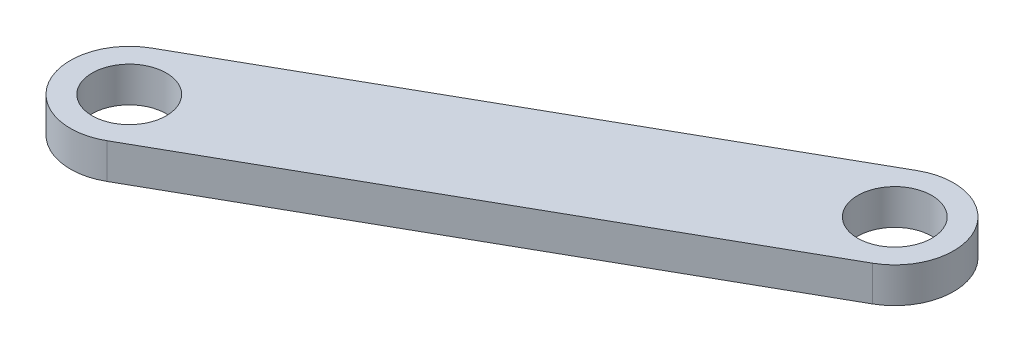
ISO-10303-21;
HEADER;
FILE_DESCRIPTION(('STEP AP214'),'2;1');
FILE_NAME('part.step','',(''),(''),'','','');
FILE_SCHEMA(('AUTOMOTIVE_DESIGN { 1 0 10303 214 1 1 1 1 }'));
ENDSEC;
DATA;
#1=APPLICATION_CONTEXT('core data for automotive mechanical design processes');
#2=APPLICATION_PROTOCOL_DEFINITION('international standard','automotive_design',2000,#1);
#3=PRODUCT_CONTEXT('',#1,'mechanical');
#4=PRODUCT('Part','Part','',(#3));
#5=PRODUCT_RELATED_PRODUCT_CATEGORY('part','',(#4));
#6=PRODUCT_DEFINITION_FORMATION('','',#4);
#7=PRODUCT_DEFINITION_CONTEXT('part definition',#1,'design');
#8=PRODUCT_DEFINITION('design','',#6,#7);
#9=PRODUCT_DEFINITION_SHAPE('','',#8);
#10=(LENGTH_UNIT() NAMED_UNIT(*) SI_UNIT(.MILLI.,.METRE.));
#11=(NAMED_UNIT(*) PLANE_ANGLE_UNIT() SI_UNIT($,.RADIAN.));
#12=(NAMED_UNIT(*) SI_UNIT($,.STERADIAN.) SOLID_ANGLE_UNIT());
#13=UNCERTAINTY_MEASURE_WITH_UNIT(LENGTH_MEASURE(1.E-05),#10,'distance_accuracy_value','');
#14=(GEOMETRIC_REPRESENTATION_CONTEXT(3) GLOBAL_UNCERTAINTY_ASSIGNED_CONTEXT((#13)) GLOBAL_UNIT_ASSIGNED_CONTEXT((#10,
#11,#12)) REPRESENTATION_CONTEXT('',''));
#15=CARTESIAN_POINT('',(0.,0.,0.));
#16=DIRECTION('',(0.,0.,1.));
#17=DIRECTION('',(1.,0.,0.));
#18=AXIS2_PLACEMENT_3D('',#15,#16,#17);
#19=CARTESIAN_POINT('',(0.,-1.905,0.));
#20=DIRECTION('',(0.,1.,0.));
#21=DIRECTION('',(0.,0.,1.));
#22=AXIS2_PLACEMENT_3D('',#19,#20,#21);
#23=CYLINDRICAL_SURFACE('',#22,3.175);
#24=CARTESIAN_POINT('',(0.,0.,0.));
#25=DIRECTION('',(0.,1.,0.));
#26=DIRECTION('',(0.,0.,-1.));
#27=AXIS2_PLACEMENT_3D('',#24,#25,#26);
#28=CIRCLE('',#27,3.175);
#29=CARTESIAN_POINT('',(1.56402198628514,0.,2.76305270062239));
#30=VERTEX_POINT('',#29);
#31=CARTESIAN_POINT('',(-1.56402198628514,0.,-2.76305270062239));
#32=VERTEX_POINT('',#31);
#33=EDGE_CURVE('E110',#30,#32,#28,.T.);
#34=ORIENTED_EDGE('',*,*,#33,.F.);
#35=DIRECTION('',(0.,1.,0.));
#36=VECTOR('',#35,1.);
#37=CARTESIAN_POINT('',(1.56402198628514,-1.905,2.76305270062239));
#38=LINE('',#37,#36);
#39=CARTESIAN_POINT('',(1.56402198628514,-1.905,2.76305270062239));
#40=VERTEX_POINT('',#39);
#41=EDGE_CURVE('E11',#40,#30,#38,.T.);
#42=ORIENTED_EDGE('',*,*,#41,.F.);
#43=CARTESIAN_POINT('',(0.,-1.905,0.));
#44=DIRECTION('',(0.,1.,0.));
#45=DIRECTION('',(0.,0.,-1.));
#46=AXIS2_PLACEMENT_3D('',#43,#44,#45);
#47=CIRCLE('',#46,3.175);
#48=CARTESIAN_POINT('',(-1.56402198628514,-1.905,-2.76305270062239));
#49=VERTEX_POINT('',#48);
#50=EDGE_CURVE('E101',#40,#49,#47,.T.);
#51=ORIENTED_EDGE('',*,*,#50,.T.);
#52=DIRECTION('',(0.,1.,0.));
#53=VECTOR('',#52,1.);
#54=CARTESIAN_POINT('',(-1.56402198628514,-1.905,-2.76305270062239));
#55=LINE('',#54,#53);
#56=EDGE_CURVE('E42',#49,#32,#55,.T.);
#57=ORIENTED_EDGE('',*,*,#56,.T.);
#58=EDGE_LOOP('',(#34,#42,#51,#57));
#59=FACE_BOUND('',#58,.T.);
#60=ADVANCED_FACE('F39',(#59),#23,.T.);
#61=CARTESIAN_POINT('',(1.56402198628514,-1.905,2.76305270062239));
#62=DIRECTION('',(0.492605350011069,0.,0.870252819093666));
#63=DIRECTION('',(0.870252819093666,0.,-0.492605350011069));
#64=AXIS2_PLACEMENT_3D('',#61,#62,#63);
#65=PLANE('',#64);
#66=DIRECTION('',(0.870252819093666,0.,-0.492605350011069));
#67=VECTOR('',#66,1.);
#68=CARTESIAN_POINT('',(1.56402198628514,0.,2.76305270062239));
#69=LINE('',#68,#67);
#70=CARTESIAN_POINT('',(-24.7985574957149,0.,17.6855527006224));
#71=VERTEX_POINT('',#70);
#72=EDGE_CURVE('E104',#71,#30,#69,.T.);
#73=ORIENTED_EDGE('',*,*,#72,.F.);
#74=DIRECTION('',(0.,1.,0.));
#75=VECTOR('',#74,1.);
#76=CARTESIAN_POINT('',(-24.7985574957149,-1.905,17.6855527006224));
#77=LINE('',#76,#75);
#78=CARTESIAN_POINT('',(-24.7985574957149,-1.905,17.6855527006224));
#79=VERTEX_POINT('',#78);
#80=EDGE_CURVE('E49',#79,#71,#77,.T.);
#81=ORIENTED_EDGE('',*,*,#80,.F.);
#82=DIRECTION('',(0.870252819093666,0.,-0.492605350011069));
#83=VECTOR('',#82,1.);
#84=CARTESIAN_POINT('',(1.56402198628514,-1.905,2.76305270062239));
#85=LINE('',#84,#83);
#86=EDGE_CURVE('E96',#79,#40,#85,.T.);
#87=ORIENTED_EDGE('',*,*,#86,.T.);
#88=ORIENTED_EDGE('',*,*,#41,.T.);
#89=EDGE_LOOP('',(#73,#81,#87,#88));
#90=FACE_BOUND('',#89,.T.);
#91=ADVANCED_FACE('F127',(#90),#65,.T.);
#92=CARTESIAN_POINT('',(-26.362579482,-1.905,14.9225));
#93=DIRECTION('',(0.,1.,0.));
#94=DIRECTION('',(0.,0.,1.));
#95=AXIS2_PLACEMENT_3D('',#92,#93,#94);
#96=CYLINDRICAL_SURFACE('',#95,3.175);
#97=CARTESIAN_POINT('',(-26.362579482,0.,14.9225));
#98=DIRECTION('',(0.,1.,0.));
#99=DIRECTION('',(0.,0.,-1.));
#100=AXIS2_PLACEMENT_3D('',#97,#98,#99);
#101=CIRCLE('',#100,3.175);
#102=CARTESIAN_POINT('',(-27.9266014682851,0.,12.1594472993776));
#103=VERTEX_POINT('',#102);
#104=EDGE_CURVE('E90',#103,#71,#101,.T.);
#105=ORIENTED_EDGE('',*,*,#104,.F.);
#106=DIRECTION('',(0.,1.,0.));
#107=VECTOR('',#106,1.);
#108=CARTESIAN_POINT('',(-27.9266014682851,-1.905,12.1594472993776));
#109=LINE('',#108,#107);
#110=CARTESIAN_POINT('',(-27.9266014682851,-1.905,12.1594472993776));
#111=VERTEX_POINT('',#110);
#112=EDGE_CURVE('E85',#111,#103,#109,.T.);
#113=ORIENTED_EDGE('',*,*,#112,.F.);
#114=CARTESIAN_POINT('',(-26.362579482,-1.905,14.9225));
#115=DIRECTION('',(0.,1.,0.));
#116=DIRECTION('',(0.,0.,-1.));
#117=AXIS2_PLACEMENT_3D('',#114,#115,#116);
#118=CIRCLE('',#117,3.175);
#119=EDGE_CURVE('E88',#111,#79,#118,.T.);
#120=ORIENTED_EDGE('',*,*,#119,.T.);
#121=ORIENTED_EDGE('',*,*,#80,.T.);
#122=EDGE_LOOP('',(#105,#113,#120,#121));
#123=FACE_BOUND('',#122,.T.);
#124=ADVANCED_FACE('F87',(#123),#96,.T.);
#125=CARTESIAN_POINT('',(-1.56402198628514,-1.905,-2.76305270062239));
#126=DIRECTION('',(-0.492605350011069,0.,-0.870252819093666));
#127=DIRECTION('',(-0.870252819093666,0.,0.492605350011069));
#128=AXIS2_PLACEMENT_3D('',#125,#126,#127);
#129=PLANE('',#128);
#130=DIRECTION('',(-0.870252819093666,0.,0.492605350011069));
#131=VECTOR('',#130,1.);
#132=CARTESIAN_POINT('',(-1.56402198628514,0.,-2.76305270062239));
#133=LINE('',#132,#131);
#134=EDGE_CURVE('E114',#32,#103,#133,.T.);
#135=ORIENTED_EDGE('',*,*,#134,.F.);
#136=ORIENTED_EDGE('',*,*,#56,.F.);
#137=DIRECTION('',(-0.870252819093666,0.,0.492605350011069));
#138=VECTOR('',#137,1.);
#139=CARTESIAN_POINT('',(-1.56402198628514,-1.905,-2.76305270062239));
#140=LINE('',#139,#138);
#141=EDGE_CURVE('E95',#49,#111,#140,.T.);
#142=ORIENTED_EDGE('',*,*,#141,.T.);
#143=ORIENTED_EDGE('',*,*,#112,.T.);
#144=EDGE_LOOP('',(#135,#136,#142,#143));
#145=FACE_BOUND('',#144,.T.);
#146=ADVANCED_FACE('F99',(#145),#129,.T.);
#147=CARTESIAN_POINT('',(0.,-1.905,0.));
#148=DIRECTION('',(0.,-1.,0.));
#149=DIRECTION('',(0.,0.,-1.));
#150=AXIS2_PLACEMENT_3D('',#147,#148,#149);
#151=PLANE('',#150);
#152=CARTESIAN_POINT('',(-26.362579482,-1.905,14.9225));
#153=DIRECTION('',(0.,1.,0.));
#154=DIRECTION('',(0.,0.,1.));
#155=AXIS2_PLACEMENT_3D('',#152,#153,#154);
#156=CIRCLE('',#155,2.);
#157=CARTESIAN_POINT('',(-26.362579482,-1.905,16.9225));
#158=VERTEX_POINT('',#157);
#159=EDGE_CURVE('E160',#158,#158,#156,.T.);
#160=ORIENTED_EDGE('',*,*,#159,.T.);
#161=EDGE_LOOP('',(#160));
#162=FACE_BOUND('',#161,.T.);
#163=CARTESIAN_POINT('',(0.,-1.905,0.));
#164=DIRECTION('',(0.,1.,0.));
#165=DIRECTION('',(0.,0.,1.));
#166=AXIS2_PLACEMENT_3D('',#163,#164,#165);
#167=CIRCLE('',#166,2.);
#168=CARTESIAN_POINT('',(0.,-1.905,2.));
#169=VERTEX_POINT('',#168);
#170=EDGE_CURVE('E115',#169,#169,#167,.T.);
#171=ORIENTED_EDGE('',*,*,#170,.T.);
#172=EDGE_LOOP('',(#171));
#173=FACE_BOUND('',#172,.T.);
#174=ORIENTED_EDGE('',*,*,#50,.F.);
#175=ORIENTED_EDGE('',*,*,#86,.F.);
#176=ORIENTED_EDGE('',*,*,#119,.F.);
#177=ORIENTED_EDGE('',*,*,#141,.F.);
#178=EDGE_LOOP('',(#174,#175,#176,#177));
#179=FACE_BOUND('',#178,.T.);
#180=ADVANCED_FACE('F94',(#162,#173,#179),#151,.T.);
#181=CARTESIAN_POINT('',(0.,0.,0.));
#182=DIRECTION('',(0.,-1.,0.));
#183=DIRECTION('',(0.,0.,-1.));
#184=AXIS2_PLACEMENT_3D('',#181,#182,#183);
#185=PLANE('',#184);
#186=CARTESIAN_POINT('',(-26.362579482,0.,14.9225));
#187=DIRECTION('',(0.,1.,0.));
#188=DIRECTION('',(0.,0.,1.));
#189=AXIS2_PLACEMENT_3D('',#186,#187,#188);
#190=CIRCLE('',#189,2.);
#191=CARTESIAN_POINT('',(-26.362579482,0.,16.9225));
#192=VERTEX_POINT('',#191);
#193=EDGE_CURVE('E163',#192,#192,#190,.T.);
#194=ORIENTED_EDGE('',*,*,#193,.F.);
#195=EDGE_LOOP('',(#194));
#196=FACE_BOUND('',#195,.T.);
#197=CARTESIAN_POINT('',(0.,0.,0.));
#198=DIRECTION('',(0.,1.,0.));
#199=DIRECTION('',(0.,0.,1.));
#200=AXIS2_PLACEMENT_3D('',#197,#198,#199);
#201=CIRCLE('',#200,2.);
#202=CARTESIAN_POINT('',(0.,0.,2.));
#203=VERTEX_POINT('',#202);
#204=EDGE_CURVE('E167',#203,#203,#201,.T.);
#205=ORIENTED_EDGE('',*,*,#204,.F.);
#206=EDGE_LOOP('',(#205));
#207=FACE_BOUND('',#206,.T.);
#208=ORIENTED_EDGE('',*,*,#33,.T.);
#209=ORIENTED_EDGE('',*,*,#134,.T.);
#210=ORIENTED_EDGE('',*,*,#104,.T.);
#211=ORIENTED_EDGE('',*,*,#72,.T.);
#212=EDGE_LOOP('',(#208,#209,#210,#211));
#213=FACE_BOUND('',#212,.T.);
#214=ADVANCED_FACE('F126',(#196,#207,#213),#185,.F.);
#215=CARTESIAN_POINT('',(0.,-1.905,0.));
#216=DIRECTION('',(0.,1.,0.));
#217=DIRECTION('',(0.,0.,1.));
#218=AXIS2_PLACEMENT_3D('',#215,#216,#217);
#219=CYLINDRICAL_SURFACE('',#218,2.);
#220=CARTESIAN_POINT('',(0.,-1.905,2.));
#221=CARTESIAN_POINT('',(0.,-1.88515625,2.));
#222=CARTESIAN_POINT('',(0.,-1.8653125,2.));
#223=CARTESIAN_POINT('',(0.,-1.825625,2.));
#224=CARTESIAN_POINT('',(0.,-1.80578125,2.));
#225=CARTESIAN_POINT('',(0.,-1.76609375,2.));
#226=CARTESIAN_POINT('',(0.,-1.74625,2.));
#227=CARTESIAN_POINT('',(0.,-1.7065625,2.));
#228=CARTESIAN_POINT('',(0.,-1.68671875,2.));
#229=CARTESIAN_POINT('',(0.,-1.64703125,2.));
#230=CARTESIAN_POINT('',(0.,-1.6271875,2.));
#231=CARTESIAN_POINT('',(0.,-1.5875,2.));
#232=CARTESIAN_POINT('',(0.,-1.56765625,2.));
#233=CARTESIAN_POINT('',(0.,-1.52796875,2.));
#234=CARTESIAN_POINT('',(0.,-1.508125,2.));
#235=CARTESIAN_POINT('',(0.,-1.4684375,2.));
#236=CARTESIAN_POINT('',(0.,-1.44859375,2.));
#237=CARTESIAN_POINT('',(0.,-1.40890625,2.));
#238=CARTESIAN_POINT('',(0.,-1.3890625,2.));
#239=CARTESIAN_POINT('',(0.,-1.349375,2.));
#240=CARTESIAN_POINT('',(0.,-1.32953125,2.));
#241=CARTESIAN_POINT('',(0.,-1.28984375,2.));
#242=CARTESIAN_POINT('',(0.,-1.27,2.));
#243=CARTESIAN_POINT('',(0.,-1.2303125,2.));
#244=CARTESIAN_POINT('',(0.,-1.21046875,2.));
#245=CARTESIAN_POINT('',(0.,-1.17078125,2.));
#246=CARTESIAN_POINT('',(0.,-1.1509375,2.));
#247=CARTESIAN_POINT('',(0.,-1.11125,2.));
#248=CARTESIAN_POINT('',(0.,-1.09140625,2.));
#249=CARTESIAN_POINT('',(0.,-1.05171875,2.));
#250=CARTESIAN_POINT('',(0.,-1.031875,2.));
#251=CARTESIAN_POINT('',(0.,-0.9921875,2.));
#252=CARTESIAN_POINT('',(0.,-0.97234375,2.));
#253=CARTESIAN_POINT('',(0.,-0.93265625,2.));
#254=CARTESIAN_POINT('',(0.,-0.9128125,2.));
#255=CARTESIAN_POINT('',(0.,-0.873125,2.));
#256=CARTESIAN_POINT('',(0.,-0.85328125,2.));
#257=CARTESIAN_POINT('',(0.,-0.81359375,2.));
#258=CARTESIAN_POINT('',(0.,-0.79375,2.));
#259=CARTESIAN_POINT('',(0.,-0.7540625,2.));
#260=CARTESIAN_POINT('',(0.,-0.73421875,2.));
#261=CARTESIAN_POINT('',(0.,-0.69453125,2.));
#262=CARTESIAN_POINT('',(0.,-0.6746875,2.));
#263=CARTESIAN_POINT('',(0.,-0.635,2.));
#264=CARTESIAN_POINT('',(0.,-0.61515625,2.));
#265=CARTESIAN_POINT('',(0.,-0.57546875,2.));
#266=CARTESIAN_POINT('',(0.,-0.555625,2.));
#267=CARTESIAN_POINT('',(0.,-0.5159375,2.));
#268=CARTESIAN_POINT('',(0.,-0.49609375,2.));
#269=CARTESIAN_POINT('',(0.,-0.45640625,2.));
#270=CARTESIAN_POINT('',(0.,-0.4365625,2.));
#271=CARTESIAN_POINT('',(0.,-0.396875,2.));
#272=CARTESIAN_POINT('',(0.,-0.37703125,2.));
#273=CARTESIAN_POINT('',(0.,-0.33734375,2.));
#274=CARTESIAN_POINT('',(0.,-0.3175,2.));
#275=CARTESIAN_POINT('',(0.,-0.2778125,2.));
#276=CARTESIAN_POINT('',(0.,-0.25796875,2.));
#277=CARTESIAN_POINT('',(0.,-0.21828125,2.));
#278=CARTESIAN_POINT('',(0.,-0.1984375,2.));
#279=CARTESIAN_POINT('',(0.,-0.15875,2.));
#280=CARTESIAN_POINT('',(0.,-0.13890625,2.));
#281=CARTESIAN_POINT('',(0.,-0.09921875,2.));
#282=CARTESIAN_POINT('',(0.,-0.0793749999999999,2.));
#283=CARTESIAN_POINT('',(0.,-0.0396874999999999,2.));
#284=CARTESIAN_POINT('',(0.,-0.01984375,2.));
#285=CARTESIAN_POINT('',(0.,0.,2.));
#286=B_SPLINE_CURVE_WITH_KNOTS('',3,(#220,#221,#222,#223,#224,#225,#226,#227,#228,#229,#230,
#231,#232,#233,#234,#235,#236,#237,#238,#239,#240,#241,#242,#243,#244,#245,#246,#247,#248,#249,
#250,#251,#252,#253,#254,#255,#256,#257,#258,#259,#260,#261,#262,#263,#264,#265,#266,#267,#268,
#269,#270,#271,#272,#273,#274,#275,#276,#277,#278,#279,#280,#281,#282,#283,#284,#285),
.UNSPECIFIED.,.F.,.F.,(4,2,2,2,2,2,2,2,2,2,2,2,2,2,2,2,2,2,2,2,2,2,2,2,2,2,2,2,2,2,2,2,4),(0.,
0.0595312500000001,0.1190625,0.17859375,0.238125,0.29765625,0.3571875,0.41671875,0.47625,
0.53578125,0.5953125,0.65484375,0.714375,0.77390625,0.8334375,0.89296875,0.9525,1.01203125,
1.0715625,1.13109375,1.190625,1.25015625,1.3096875,1.36921875,1.42875,1.48828125,1.5478125,
1.60734375,1.666875,1.72640625,1.7859375,1.84546875,1.905),.UNSPECIFIED.);
#287=EDGE_CURVE('BSEAM145',#169,#203,#286,.T.);
#288=ORIENTED_EDGE('',*,*,#170,.F.);
#289=ORIENTED_EDGE('',*,*,#204,.T.);
#290=ORIENTED_EDGE('',*,*,#287,.T.);
#291=ORIENTED_EDGE('',*,*,#287,.F.);
#292=EDGE_LOOP('',(#288,#290,#289,#291));
#293=FACE_BOUND('',#292,.T.);
#294=ADVANCED_FACE('F145',(#293),#219,.F.);
#295=CARTESIAN_POINT('',(-26.362579482,-1.905,14.9225));
#296=DIRECTION('',(0.,1.,0.));
#297=DIRECTION('',(0.,0.,1.));
#298=AXIS2_PLACEMENT_3D('',#295,#296,#297);
#299=CYLINDRICAL_SURFACE('',#298,2.);
#300=CARTESIAN_POINT('',(-26.362579482,-1.905,16.9225));
#301=CARTESIAN_POINT('',(-26.362579482,-1.88515625,16.9225));
#302=CARTESIAN_POINT('',(-26.362579482,-1.8653125,16.9225));
#303=CARTESIAN_POINT('',(-26.362579482,-1.825625,16.9225));
#304=CARTESIAN_POINT('',(-26.362579482,-1.80578125,16.9225));
#305=CARTESIAN_POINT('',(-26.362579482,-1.76609375,16.9225));
#306=CARTESIAN_POINT('',(-26.362579482,-1.74625,16.9225));
#307=CARTESIAN_POINT('',(-26.362579482,-1.7065625,16.9225));
#308=CARTESIAN_POINT('',(-26.362579482,-1.68671875,16.9225));
#309=CARTESIAN_POINT('',(-26.362579482,-1.64703125,16.9225));
#310=CARTESIAN_POINT('',(-26.362579482,-1.6271875,16.9225));
#311=CARTESIAN_POINT('',(-26.362579482,-1.5875,16.9225));
#312=CARTESIAN_POINT('',(-26.362579482,-1.56765625,16.9225));
#313=CARTESIAN_POINT('',(-26.362579482,-1.52796875,16.9225));
#314=CARTESIAN_POINT('',(-26.362579482,-1.508125,16.9225));
#315=CARTESIAN_POINT('',(-26.362579482,-1.4684375,16.9225));
#316=CARTESIAN_POINT('',(-26.362579482,-1.44859375,16.9225));
#317=CARTESIAN_POINT('',(-26.362579482,-1.40890625,16.9225));
#318=CARTESIAN_POINT('',(-26.362579482,-1.3890625,16.9225));
#319=CARTESIAN_POINT('',(-26.362579482,-1.349375,16.9225));
#320=CARTESIAN_POINT('',(-26.362579482,-1.32953125,16.9225));
#321=CARTESIAN_POINT('',(-26.362579482,-1.28984375,16.9225));
#322=CARTESIAN_POINT('',(-26.362579482,-1.27,16.9225));
#323=CARTESIAN_POINT('',(-26.362579482,-1.2303125,16.9225));
#324=CARTESIAN_POINT('',(-26.362579482,-1.21046875,16.9225));
#325=CARTESIAN_POINT('',(-26.362579482,-1.17078125,16.9225));
#326=CARTESIAN_POINT('',(-26.362579482,-1.1509375,16.9225));
#327=CARTESIAN_POINT('',(-26.362579482,-1.11125,16.9225));
#328=CARTESIAN_POINT('',(-26.362579482,-1.09140625,16.9225));
#329=CARTESIAN_POINT('',(-26.362579482,-1.05171875,16.9225));
#330=CARTESIAN_POINT('',(-26.362579482,-1.031875,16.9225));
#331=CARTESIAN_POINT('',(-26.362579482,-0.9921875,16.9225));
#332=CARTESIAN_POINT('',(-26.362579482,-0.97234375,16.9225));
#333=CARTESIAN_POINT('',(-26.362579482,-0.93265625,16.9225));
#334=CARTESIAN_POINT('',(-26.362579482,-0.9128125,16.9225));
#335=CARTESIAN_POINT('',(-26.362579482,-0.873125,16.9225));
#336=CARTESIAN_POINT('',(-26.362579482,-0.85328125,16.9225));
#337=CARTESIAN_POINT('',(-26.362579482,-0.81359375,16.9225));
#338=CARTESIAN_POINT('',(-26.362579482,-0.79375,16.9225));
#339=CARTESIAN_POINT('',(-26.362579482,-0.7540625,16.9225));
#340=CARTESIAN_POINT('',(-26.362579482,-0.73421875,16.9225));
#341=CARTESIAN_POINT('',(-26.362579482,-0.69453125,16.9225));
#342=CARTESIAN_POINT('',(-26.362579482,-0.6746875,16.9225));
#343=CARTESIAN_POINT('',(-26.362579482,-0.635,16.9225));
#344=CARTESIAN_POINT('',(-26.362579482,-0.61515625,16.9225));
#345=CARTESIAN_POINT('',(-26.362579482,-0.57546875,16.9225));
#346=CARTESIAN_POINT('',(-26.362579482,-0.555625,16.9225));
#347=CARTESIAN_POINT('',(-26.362579482,-0.5159375,16.9225));
#348=CARTESIAN_POINT('',(-26.362579482,-0.49609375,16.9225));
#349=CARTESIAN_POINT('',(-26.362579482,-0.45640625,16.9225));
#350=CARTESIAN_POINT('',(-26.362579482,-0.4365625,16.9225));
#351=CARTESIAN_POINT('',(-26.362579482,-0.396875,16.9225));
#352=CARTESIAN_POINT('',(-26.362579482,-0.37703125,16.9225));
#353=CARTESIAN_POINT('',(-26.362579482,-0.33734375,16.9225));
#354=CARTESIAN_POINT('',(-26.362579482,-0.3175,16.9225));
#355=CARTESIAN_POINT('',(-26.362579482,-0.2778125,16.9225));
#356=CARTESIAN_POINT('',(-26.362579482,-0.25796875,16.9225));
#357=CARTESIAN_POINT('',(-26.362579482,-0.21828125,16.9225));
#358=CARTESIAN_POINT('',(-26.362579482,-0.1984375,16.9225));
#359=CARTESIAN_POINT('',(-26.362579482,-0.15875,16.9225));
#360=CARTESIAN_POINT('',(-26.362579482,-0.13890625,16.9225));
#361=CARTESIAN_POINT('',(-26.362579482,-0.09921875,16.9225));
#362=CARTESIAN_POINT('',(-26.362579482,-0.0793749999999999,16.9225));
#363=CARTESIAN_POINT('',(-26.362579482,-0.0396874999999999,16.9225));
#364=CARTESIAN_POINT('',(-26.362579482,-0.01984375,16.9225));
#365=CARTESIAN_POINT('',(-26.362579482,0.,16.9225));
#366=B_SPLINE_CURVE_WITH_KNOTS('',3,(#300,#301,#302,#303,#304,#305,#306,#307,#308,#309,#310,
#311,#312,#313,#314,#315,#316,#317,#318,#319,#320,#321,#322,#323,#324,#325,#326,#327,#328,#329,
#330,#331,#332,#333,#334,#335,#336,#337,#338,#339,#340,#341,#342,#343,#344,#345,#346,#347,#348,
#349,#350,#351,#352,#353,#354,#355,#356,#357,#358,#359,#360,#361,#362,#363,#364,#365),
.UNSPECIFIED.,.F.,.F.,(4,2,2,2,2,2,2,2,2,2,2,2,2,2,2,2,2,2,2,2,2,2,2,2,2,2,2,2,2,2,2,2,4),(0.,
0.0595312500000001,0.1190625,0.17859375,0.238125,0.29765625,0.3571875,0.41671875,0.47625,
0.53578125,0.5953125,0.65484375,0.714375,0.77390625,0.8334375,0.89296875,0.9525,1.01203125,
1.0715625,1.13109375,1.190625,1.25015625,1.3096875,1.36921875,1.42875,1.48828125,1.5478125,
1.60734375,1.666875,1.72640625,1.7859375,1.84546875,1.905),.UNSPECIFIED.);
#367=EDGE_CURVE('BSEAM152',#158,#192,#366,.T.);
#368=ORIENTED_EDGE('',*,*,#159,.F.);
#369=ORIENTED_EDGE('',*,*,#193,.T.);
#370=ORIENTED_EDGE('',*,*,#367,.T.);
#371=ORIENTED_EDGE('',*,*,#367,.F.);
#372=EDGE_LOOP('',(#368,#370,#369,#371));
#373=FACE_BOUND('',#372,.T.);
#374=ADVANCED_FACE('F152',(#373),#299,.F.);
#375=CLOSED_SHELL('',(#60,#91,#124,#146,#180,#214,#294,#374));
#376=MANIFOLD_SOLID_BREP('B2',#375);
#377=ADVANCED_BREP_SHAPE_REPRESENTATION('',(#18,#376),#14);
#378=SHAPE_DEFINITION_REPRESENTATION(#9,#377);
ENDSEC;
END-ISO-10303-21;
